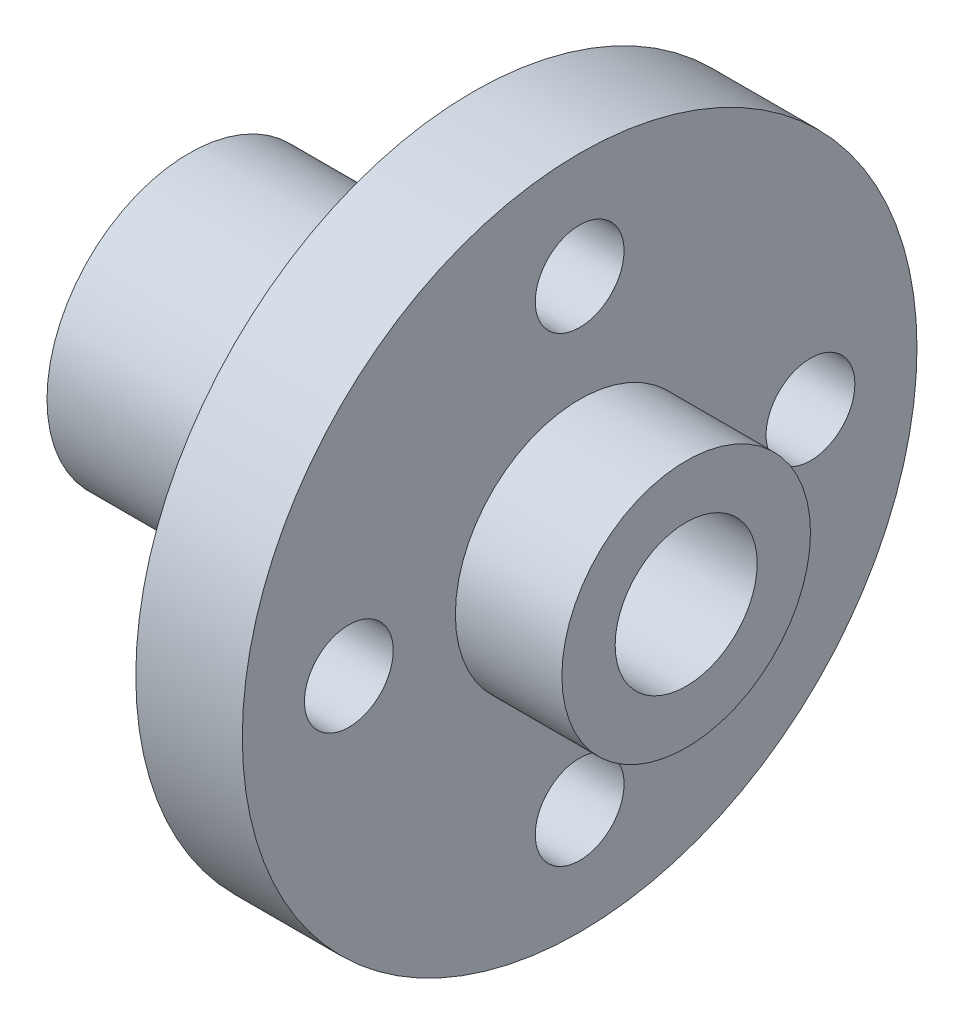
ISO-10303-21;
HEADER;
FILE_DESCRIPTION(('STEP AP214'),'2;1');
FILE_NAME('part.step','',(''),(''),'','','');
FILE_SCHEMA(('AUTOMOTIVE_DESIGN { 1 0 10303 214 1 1 1 1 }'));
ENDSEC;
DATA;
#1=APPLICATION_CONTEXT('core data for automotive mechanical design processes');
#2=APPLICATION_PROTOCOL_DEFINITION('international standard','automotive_design',2000,#1);
#3=PRODUCT_CONTEXT('',#1,'mechanical');
#4=PRODUCT('Part','Part','',(#3));
#5=PRODUCT_RELATED_PRODUCT_CATEGORY('part','',(#4));
#6=PRODUCT_DEFINITION_FORMATION('','',#4);
#7=PRODUCT_DEFINITION_CONTEXT('part definition',#1,'design');
#8=PRODUCT_DEFINITION('design','',#6,#7);
#9=PRODUCT_DEFINITION_SHAPE('','',#8);
#10=(LENGTH_UNIT() NAMED_UNIT(*) SI_UNIT(.MILLI.,.METRE.));
#11=(NAMED_UNIT(*) PLANE_ANGLE_UNIT() SI_UNIT($,.RADIAN.));
#12=(NAMED_UNIT(*) SI_UNIT($,.STERADIAN.) SOLID_ANGLE_UNIT());
#13=UNCERTAINTY_MEASURE_WITH_UNIT(LENGTH_MEASURE(1.E-05),#10,'distance_accuracy_value','');
#14=(GEOMETRIC_REPRESENTATION_CONTEXT(3) GLOBAL_UNCERTAINTY_ASSIGNED_CONTEXT((#13)) GLOBAL_UNIT_ASSIGNED_CONTEXT((#10,
#11,#12)) REPRESENTATION_CONTEXT('',''));
#15=CARTESIAN_POINT('',(0.,0.,0.));
#16=DIRECTION('',(0.,0.,1.));
#17=DIRECTION('',(1.,0.,0.));
#18=AXIS2_PLACEMENT_3D('',#15,#16,#17);
#19=CARTESIAN_POINT('',(3.,0.,0.));
#20=DIRECTION('',(-1.,0.,0.));
#21=DIRECTION('',(0.,0.,1.));
#22=AXIS2_PLACEMENT_3D('',#19,#20,#21);
#23=CYLINDRICAL_SURFACE('',#22,9.5);
#24=CARTESIAN_POINT('',(3.,0.,0.));
#25=DIRECTION('',(1.,0.,0.));
#26=DIRECTION('',(0.,0.,-1.));
#27=AXIS2_PLACEMENT_3D('',#24,#25,#26);
#28=CIRCLE('',#27,9.5);
#29=CARTESIAN_POINT('',(3.,0.,-9.5));
#30=VERTEX_POINT('',#29);
#31=EDGE_CURVE('E42',#30,#30,#28,.T.);
#32=ORIENTED_EDGE('',*,*,#31,.F.);
#33=EDGE_LOOP('',(#32));
#34=FACE_BOUND('',#33,.T.);
#35=CARTESIAN_POINT('',(0.,0.,0.));
#36=DIRECTION('',(1.,0.,0.));
#37=DIRECTION('',(0.,0.,-1.));
#38=AXIS2_PLACEMENT_3D('',#35,#36,#37);
#39=CIRCLE('',#38,9.5);
#40=CARTESIAN_POINT('',(0.,0.,-9.5));
#41=VERTEX_POINT('',#40);
#42=EDGE_CURVE('E38',#41,#41,#39,.T.);
#43=ORIENTED_EDGE('',*,*,#42,.T.);
#44=EDGE_LOOP('',(#43));
#45=FACE_BOUND('',#44,.T.);
#46=ADVANCED_FACE('F34',(#34,#45),#23,.T.);
#47=CARTESIAN_POINT('',(3.,6.5,0.));
#48=DIRECTION('',(-1.,0.,0.));
#49=DIRECTION('',(0.,0.,1.));
#50=AXIS2_PLACEMENT_3D('',#47,#48,#49);
#51=CYLINDRICAL_SURFACE('',#50,1.25);
#52=CARTESIAN_POINT('',(3.,6.5,0.));
#53=DIRECTION('',(1.,0.,0.));
#54=DIRECTION('',(0.,0.,-1.));
#55=AXIS2_PLACEMENT_3D('',#52,#53,#54);
#56=CIRCLE('',#55,1.25);
#57=CARTESIAN_POINT('',(3.,6.5,-1.25));
#58=VERTEX_POINT('',#57);
#59=EDGE_CURVE('E47',#58,#58,#56,.T.);
#60=ORIENTED_EDGE('',*,*,#59,.T.);
#61=EDGE_LOOP('',(#60));
#62=FACE_BOUND('',#61,.T.);
#63=CARTESIAN_POINT('',(0.,6.5,0.));
#64=DIRECTION('',(1.,0.,0.));
#65=DIRECTION('',(0.,0.,-1.));
#66=AXIS2_PLACEMENT_3D('',#63,#64,#65);
#67=CIRCLE('',#66,1.25);
#68=CARTESIAN_POINT('',(0.,6.5,-1.25));
#69=VERTEX_POINT('',#68);
#70=EDGE_CURVE('E60',#69,#69,#67,.T.);
#71=ORIENTED_EDGE('',*,*,#70,.F.);
#72=EDGE_LOOP('',(#71));
#73=FACE_BOUND('',#72,.T.);
#74=ADVANCED_FACE('F83',(#62,#73),#51,.F.);
#75=CARTESIAN_POINT('',(3.,0.,-6.5));
#76=DIRECTION('',(-1.,0.,0.));
#77=DIRECTION('',(0.,0.,1.));
#78=AXIS2_PLACEMENT_3D('',#75,#76,#77);
#79=CYLINDRICAL_SURFACE('',#78,1.25);
#80=CARTESIAN_POINT('',(3.,0.,-6.5));
#81=DIRECTION('',(1.,0.,0.));
#82=DIRECTION('',(0.,0.,-1.));
#83=AXIS2_PLACEMENT_3D('',#80,#81,#82);
#84=CIRCLE('',#83,1.25);
#85=CARTESIAN_POINT('',(3.,0.,-7.75));
#86=VERTEX_POINT('',#85);
#87=EDGE_CURVE('E74',#86,#86,#84,.T.);
#88=ORIENTED_EDGE('',*,*,#87,.T.);
#89=EDGE_LOOP('',(#88));
#90=FACE_BOUND('',#89,.T.);
#91=CARTESIAN_POINT('',(0.,0.,-6.5));
#92=DIRECTION('',(1.,0.,0.));
#93=DIRECTION('',(0.,0.,-1.));
#94=AXIS2_PLACEMENT_3D('',#91,#92,#93);
#95=CIRCLE('',#94,1.25);
#96=CARTESIAN_POINT('',(0.,0.,-7.75));
#97=VERTEX_POINT('',#96);
#98=EDGE_CURVE('E58',#97,#97,#95,.T.);
#99=ORIENTED_EDGE('',*,*,#98,.F.);
#100=EDGE_LOOP('',(#99));
#101=FACE_BOUND('',#100,.T.);
#102=ADVANCED_FACE('F100',(#90,#101),#79,.F.);
#103=CARTESIAN_POINT('',(3.,-6.5,0.));
#104=DIRECTION('',(-1.,0.,0.));
#105=DIRECTION('',(0.,0.,1.));
#106=AXIS2_PLACEMENT_3D('',#103,#104,#105);
#107=CYLINDRICAL_SURFACE('',#106,1.25);
#108=CARTESIAN_POINT('',(3.,-6.5,0.));
#109=DIRECTION('',(1.,0.,0.));
#110=DIRECTION('',(0.,0.,-1.));
#111=AXIS2_PLACEMENT_3D('',#108,#109,#110);
#112=CIRCLE('',#111,1.25);
#113=CARTESIAN_POINT('',(3.,-6.5,-1.25));
#114=VERTEX_POINT('',#113);
#115=EDGE_CURVE('E69',#114,#114,#112,.T.);
#116=ORIENTED_EDGE('',*,*,#115,.T.);
#117=EDGE_LOOP('',(#116));
#118=FACE_BOUND('',#117,.T.);
#119=CARTESIAN_POINT('',(0.,-6.5,0.));
#120=DIRECTION('',(1.,0.,0.));
#121=DIRECTION('',(0.,0.,-1.));
#122=AXIS2_PLACEMENT_3D('',#119,#120,#121);
#123=CIRCLE('',#122,1.25);
#124=CARTESIAN_POINT('',(0.,-6.5,-1.25));
#125=VERTEX_POINT('',#124);
#126=EDGE_CURVE('E54',#125,#125,#123,.T.);
#127=ORIENTED_EDGE('',*,*,#126,.F.);
#128=EDGE_LOOP('',(#127));
#129=FACE_BOUND('',#128,.T.);
#130=ADVANCED_FACE('F105',(#118,#129),#107,.F.);
#131=CARTESIAN_POINT('',(3.,0.,6.5));
#132=DIRECTION('',(-1.,0.,0.));
#133=DIRECTION('',(0.,0.,1.));
#134=AXIS2_PLACEMENT_3D('',#131,#132,#133);
#135=CYLINDRICAL_SURFACE('',#134,1.25);
#136=CARTESIAN_POINT('',(3.,0.,6.5));
#137=DIRECTION('',(1.,0.,0.));
#138=DIRECTION('',(0.,0.,-1.));
#139=AXIS2_PLACEMENT_3D('',#136,#137,#138);
#140=CIRCLE('',#139,1.25);
#141=CARTESIAN_POINT('',(3.,0.,5.25));
#142=VERTEX_POINT('',#141);
#143=EDGE_CURVE('E65',#142,#142,#140,.T.);
#144=ORIENTED_EDGE('',*,*,#143,.T.);
#145=EDGE_LOOP('',(#144));
#146=FACE_BOUND('',#145,.T.);
#147=CARTESIAN_POINT('',(0.,0.,6.5));
#148=DIRECTION('',(1.,0.,0.));
#149=DIRECTION('',(0.,0.,-1.));
#150=AXIS2_PLACEMENT_3D('',#147,#148,#149);
#151=CIRCLE('',#150,1.25);
#152=CARTESIAN_POINT('',(0.,0.,5.25));
#153=VERTEX_POINT('',#152);
#154=EDGE_CURVE('E51',#153,#153,#151,.T.);
#155=ORIENTED_EDGE('',*,*,#154,.F.);
#156=EDGE_LOOP('',(#155));
#157=FACE_BOUND('',#156,.T.);
#158=ADVANCED_FACE('F36',(#146,#157),#135,.F.);
#159=CARTESIAN_POINT('',(3.,0.,0.));
#160=DIRECTION('',(1.,0.,0.));
#161=DIRECTION('',(0.,0.,-1.));
#162=AXIS2_PLACEMENT_3D('',#159,#160,#161);
#163=PLANE('',#162);
#164=ORIENTED_EDGE('',*,*,#143,.F.);
#165=EDGE_LOOP('',(#164));
#166=FACE_BOUND('',#165,.T.);
#167=ORIENTED_EDGE('',*,*,#115,.F.);
#168=EDGE_LOOP('',(#167));
#169=FACE_BOUND('',#168,.T.);
#170=ORIENTED_EDGE('',*,*,#87,.F.);
#171=EDGE_LOOP('',(#170));
#172=FACE_BOUND('',#171,.T.);
#173=ORIENTED_EDGE('',*,*,#59,.F.);
#174=EDGE_LOOP('',(#173));
#175=FACE_BOUND('',#174,.T.);
#176=ORIENTED_EDGE('',*,*,#31,.T.);
#177=EDGE_LOOP('',(#176));
#178=FACE_BOUND('',#177,.T.);
#179=CARTESIAN_POINT('',(3.,0.,0.));
#180=DIRECTION('',(1.,0.,0.));
#181=DIRECTION('',(0.,0.,-1.));
#182=AXIS2_PLACEMENT_3D('',#179,#180,#181);
#183=CIRCLE('',#182,3.5);
#184=CARTESIAN_POINT('',(3.,0.,-3.5));
#185=VERTEX_POINT('',#184);
#186=EDGE_CURVE('E10',#185,#185,#183,.T.);
#187=ORIENTED_EDGE('',*,*,#186,.F.);
#188=EDGE_LOOP('',(#187));
#189=FACE_BOUND('',#188,.T.);
#190=ADVANCED_FACE('F86',(#166,#169,#172,#175,#178,#189),#163,.T.);
#191=CARTESIAN_POINT('',(0.,0.,0.));
#192=DIRECTION('',(1.,0.,0.));
#193=DIRECTION('',(0.,0.,-1.));
#194=AXIS2_PLACEMENT_3D('',#191,#192,#193);
#195=PLANE('',#194);
#196=CARTESIAN_POINT('',(0.,0.,0.));
#197=DIRECTION('',(1.,0.,0.));
#198=DIRECTION('',(0.,0.,-1.));
#199=AXIS2_PLACEMENT_3D('',#196,#197,#198);
#200=CIRCLE('',#199,4.);
#201=CARTESIAN_POINT('',(0.,0.,-4.));
#202=VERTEX_POINT('',#201);
#203=EDGE_CURVE('E132',#202,#202,#200,.T.);
#204=ORIENTED_EDGE('',*,*,#203,.T.);
#205=EDGE_LOOP('',(#204));
#206=FACE_BOUND('',#205,.T.);
#207=ORIENTED_EDGE('',*,*,#154,.T.);
#208=EDGE_LOOP('',(#207));
#209=FACE_BOUND('',#208,.T.);
#210=ORIENTED_EDGE('',*,*,#126,.T.);
#211=EDGE_LOOP('',(#210));
#212=FACE_BOUND('',#211,.T.);
#213=ORIENTED_EDGE('',*,*,#98,.T.);
#214=EDGE_LOOP('',(#213));
#215=FACE_BOUND('',#214,.T.);
#216=ORIENTED_EDGE('',*,*,#70,.T.);
#217=EDGE_LOOP('',(#216));
#218=FACE_BOUND('',#217,.T.);
#219=ORIENTED_EDGE('',*,*,#42,.F.);
#220=EDGE_LOOP('',(#219));
#221=FACE_BOUND('',#220,.T.);
#222=ADVANCED_FACE('F89',(#206,#209,#212,#215,#218,#221),#195,.F.);
#223=CARTESIAN_POINT('',(6.,0.,0.));
#224=DIRECTION('',(-1.,0.,0.));
#225=DIRECTION('',(0.,0.,1.));
#226=AXIS2_PLACEMENT_3D('',#223,#224,#225);
#227=CYLINDRICAL_SURFACE('',#226,2.);
#228=CARTESIAN_POINT('',(-6.50000000000001,0.,0.));
#229=DIRECTION('',(-1.,0.,0.));
#230=DIRECTION('',(0.,0.,1.));
#231=AXIS2_PLACEMENT_3D('',#228,#229,#230);
#232=CIRCLE('',#231,2.);
#233=CARTESIAN_POINT('',(-6.50000000000001,0.,2.));
#234=VERTEX_POINT('',#233);
#235=EDGE_CURVE('E143',#234,#234,#232,.T.);
#236=ORIENTED_EDGE('',*,*,#235,.T.);
#237=EDGE_LOOP('',(#236));
#238=FACE_BOUND('',#237,.T.);
#239=CARTESIAN_POINT('',(6.,0.,0.));
#240=DIRECTION('',(1.,0.,0.));
#241=DIRECTION('',(0.,0.,-1.));
#242=AXIS2_PLACEMENT_3D('',#239,#240,#241);
#243=CIRCLE('',#242,2.);
#244=CARTESIAN_POINT('',(6.,0.,-2.));
#245=VERTEX_POINT('',#244);
#246=EDGE_CURVE('E140',#245,#245,#243,.T.);
#247=ORIENTED_EDGE('',*,*,#246,.T.);
#248=EDGE_LOOP('',(#247));
#249=FACE_BOUND('',#248,.T.);
#250=ADVANCED_FACE('F118',(#238,#249),#227,.F.);
#251=CARTESIAN_POINT('',(6.,0.,0.));
#252=DIRECTION('',(-1.,0.,0.));
#253=DIRECTION('',(0.,0.,1.));
#254=AXIS2_PLACEMENT_3D('',#251,#252,#253);
#255=CYLINDRICAL_SURFACE('',#254,3.5);
#256=ORIENTED_EDGE('',*,*,#186,.T.);
#257=EDGE_LOOP('',(#256));
#258=FACE_BOUND('',#257,.T.);
#259=CARTESIAN_POINT('',(6.,0.,0.));
#260=DIRECTION('',(1.,0.,0.));
#261=DIRECTION('',(0.,0.,-1.));
#262=AXIS2_PLACEMENT_3D('',#259,#260,#261);
#263=CIRCLE('',#262,3.5);
#264=CARTESIAN_POINT('',(6.,0.,-3.5));
#265=VERTEX_POINT('',#264);
#266=EDGE_CURVE('E55',#265,#265,#263,.T.);
#267=ORIENTED_EDGE('',*,*,#266,.F.);
#268=EDGE_LOOP('',(#267));
#269=FACE_BOUND('',#268,.T.);
#270=ADVANCED_FACE('F126',(#258,#269),#255,.T.);
#271=CARTESIAN_POINT('',(6.,0.,0.));
#272=DIRECTION('',(1.,0.,0.));
#273=DIRECTION('',(0.,0.,-1.));
#274=AXIS2_PLACEMENT_3D('',#271,#272,#273);
#275=PLANE('',#274);
#276=ORIENTED_EDGE('',*,*,#246,.F.);
#277=EDGE_LOOP('',(#276));
#278=FACE_BOUND('',#277,.T.);
#279=ORIENTED_EDGE('',*,*,#266,.T.);
#280=EDGE_LOOP('',(#279));
#281=FACE_BOUND('',#280,.T.);
#282=ADVANCED_FACE('F151',(#278,#281),#275,.T.);
#283=CARTESIAN_POINT('',(-8.,0.,0.));
#284=DIRECTION('',(1.,0.,0.));
#285=DIRECTION('',(0.,0.,-1.));
#286=AXIS2_PLACEMENT_3D('',#283,#284,#285);
#287=CYLINDRICAL_SURFACE('',#286,4.);
#288=CARTESIAN_POINT('',(-8.,0.,0.));
#289=DIRECTION('',(1.,0.,0.));
#290=DIRECTION('',(0.,0.,-1.));
#291=AXIS2_PLACEMENT_3D('',#288,#289,#290);
#292=CIRCLE('',#291,4.);
#293=CARTESIAN_POINT('',(-8.,0.,-4.));
#294=VERTEX_POINT('',#293);
#295=EDGE_CURVE('E136',#294,#294,#292,.T.);
#296=ORIENTED_EDGE('',*,*,#295,.T.);
#297=EDGE_LOOP('',(#296));
#298=FACE_BOUND('',#297,.T.);
#299=ORIENTED_EDGE('',*,*,#203,.F.);
#300=EDGE_LOOP('',(#299));
#301=FACE_BOUND('',#300,.T.);
#302=ADVANCED_FACE('F158',(#298,#301),#287,.T.);
#303=CARTESIAN_POINT('',(-8.,0.,0.));
#304=DIRECTION('',(1.,0.,0.));
#305=DIRECTION('',(0.,0.,-1.));
#306=AXIS2_PLACEMENT_3D('',#303,#304,#305);
#307=PLANE('',#306);
#308=CARTESIAN_POINT('',(-8.,0.,0.));
#309=DIRECTION('',(-1.,0.,0.));
#310=DIRECTION('',(0.,0.,1.));
#311=AXIS2_PLACEMENT_3D('',#308,#309,#310);
#312=CIRCLE('',#311,3.5);
#313=CARTESIAN_POINT('',(-8.,0.,3.5));
#314=VERTEX_POINT('',#313);
#315=EDGE_CURVE('E137',#314,#314,#312,.T.);
#316=ORIENTED_EDGE('',*,*,#315,.F.);
#317=EDGE_LOOP('',(#316));
#318=FACE_BOUND('',#317,.T.);
#319=ORIENTED_EDGE('',*,*,#295,.F.);
#320=EDGE_LOOP('',(#319));
#321=FACE_BOUND('',#320,.T.);
#322=ADVANCED_FACE('F164',(#318,#321),#307,.F.);
#323=CARTESIAN_POINT('',(-8.,0.,0.));
#324=DIRECTION('',(-1.,0.,0.));
#325=DIRECTION('',(0.,0.,1.));
#326=AXIS2_PLACEMENT_3D('',#323,#324,#325);
#327=CONICAL_SURFACE('',#326,3.5,0.78539816339745);
#328=ORIENTED_EDGE('',*,*,#235,.F.);
#329=EDGE_LOOP('',(#328));
#330=FACE_BOUND('',#329,.T.);
#331=ORIENTED_EDGE('',*,*,#315,.T.);
#332=EDGE_LOOP('',(#331));
#333=FACE_BOUND('',#332,.T.);
#334=ADVANCED_FACE('F168',(#330,#333),#327,.F.);
#335=CLOSED_SHELL('',(#46,#74,#102,#130,#158,#190,#222,#250,#270,#282,#302,#322,#334));
#336=MANIFOLD_SOLID_BREP('B2',#335);
#337=ADVANCED_BREP_SHAPE_REPRESENTATION('',(#18,#336),#14);
#338=SHAPE_DEFINITION_REPRESENTATION(#9,#337);
ENDSEC;
END-ISO-10303-21;
